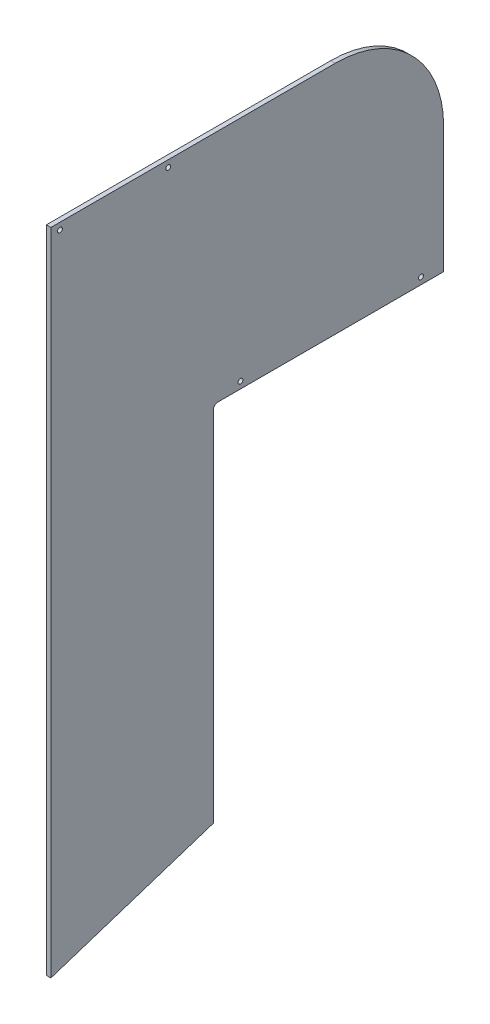
ISO-10303-21;
HEADER;
FILE_DESCRIPTION(('STEP AP214'),'2;1');
FILE_NAME('part.step','',(''),(''),'','','');
FILE_SCHEMA(('AUTOMOTIVE_DESIGN { 1 0 10303 214 1 1 1 1 }'));
ENDSEC;
DATA;
#1=APPLICATION_CONTEXT('core data for automotive mechanical design processes');
#2=APPLICATION_PROTOCOL_DEFINITION('international standard','automotive_design',2000,#1);
#3=PRODUCT_CONTEXT('',#1,'mechanical');
#4=PRODUCT('Part','Part','',(#3));
#5=PRODUCT_RELATED_PRODUCT_CATEGORY('part','',(#4));
#6=PRODUCT_DEFINITION_FORMATION('','',#4);
#7=PRODUCT_DEFINITION_CONTEXT('part definition',#1,'design');
#8=PRODUCT_DEFINITION('design','',#6,#7);
#9=PRODUCT_DEFINITION_SHAPE('','',#8);
#10=(LENGTH_UNIT() NAMED_UNIT(*) SI_UNIT(.MILLI.,.METRE.));
#11=(NAMED_UNIT(*) PLANE_ANGLE_UNIT() SI_UNIT($,.RADIAN.));
#12=(NAMED_UNIT(*) SI_UNIT($,.STERADIAN.) SOLID_ANGLE_UNIT());
#13=UNCERTAINTY_MEASURE_WITH_UNIT(LENGTH_MEASURE(1.E-05),#10,'distance_accuracy_value','');
#14=(GEOMETRIC_REPRESENTATION_CONTEXT(3) GLOBAL_UNCERTAINTY_ASSIGNED_CONTEXT((#13)) GLOBAL_UNIT_ASSIGNED_CONTEXT((#10,
#11,#12)) REPRESENTATION_CONTEXT('',''));
#15=CARTESIAN_POINT('',(0.,0.,0.));
#16=DIRECTION('',(0.,0.,1.));
#17=DIRECTION('',(1.,0.,0.));
#18=AXIS2_PLACEMENT_3D('',#15,#16,#17);
#19=CARTESIAN_POINT('',(0.,0.,0.));
#20=DIRECTION('',(1.,0.,0.));
#21=DIRECTION('',(0.,0.,-1.));
#22=AXIS2_PLACEMENT_3D('',#19,#20,#21);
#23=PLANE('',#22);
#24=CARTESIAN_POINT('',(0.,-155.575,9.525));
#25=DIRECTION('',(1.,0.,0.));
#26=DIRECTION('',(0.,0.,-1.));
#27=AXIS2_PLACEMENT_3D('',#24,#25,#26);
#28=CIRCLE('',#27,3.3655);
#29=CARTESIAN_POINT('',(0.,-155.575,6.1595));
#30=VERTEX_POINT('',#29);
#31=EDGE_CURVE('E126',#30,#30,#28,.T.);
#32=ORIENTED_EDGE('',*,*,#31,.T.);
#33=EDGE_LOOP('',(#32));
#34=FACE_BOUND('',#33,.T.);
#35=CARTESIAN_POINT('',(0.,-155.575,-244.475));
#36=DIRECTION('',(1.,0.,0.));
#37=DIRECTION('',(0.,0.,-1.));
#38=AXIS2_PLACEMENT_3D('',#35,#36,#37);
#39=CIRCLE('',#38,3.3655);
#40=CARTESIAN_POINT('',(0.,-155.575,-247.8405));
#41=VERTEX_POINT('',#40);
#42=EDGE_CURVE('E194',#41,#41,#39,.T.);
#43=ORIENTED_EDGE('',*,*,#42,.T.);
#44=EDGE_LOOP('',(#43));
#45=FACE_BOUND('',#44,.T.);
#46=CARTESIAN_POINT('',(0.,155.575,111.125));
#47=DIRECTION('',(1.,0.,0.));
#48=DIRECTION('',(0.,0.,-1.));
#49=AXIS2_PLACEMENT_3D('',#46,#47,#48);
#50=CIRCLE('',#49,3.3655);
#51=CARTESIAN_POINT('',(0.,155.575,107.7595));
#52=VERTEX_POINT('',#51);
#53=EDGE_CURVE('E197',#52,#52,#50,.T.);
#54=ORIENTED_EDGE('',*,*,#53,.T.);
#55=EDGE_LOOP('',(#54));
#56=FACE_BOUND('',#55,.T.);
#57=CARTESIAN_POINT('',(0.,155.575,263.525));
#58=DIRECTION('',(1.,0.,0.));
#59=DIRECTION('',(0.,0.,-1.));
#60=AXIS2_PLACEMENT_3D('',#57,#58,#59);
#61=CIRCLE('',#60,3.3655);
#62=CARTESIAN_POINT('',(0.,155.575,260.1595));
#63=VERTEX_POINT('',#62);
#64=EDGE_CURVE('E130',#63,#63,#61,.T.);
#65=ORIENTED_EDGE('',*,*,#64,.T.);
#66=EDGE_LOOP('',(#65));
#67=FACE_BOUND('',#66,.T.);
#68=DIRECTION('',(0.,1.,0.));
#69=VECTOR('',#68,1.);
#70=CARTESIAN_POINT('',(0.,165.1,276.225));
#71=LINE('',#70,#69);
#72=CARTESIAN_POINT('',(0.,165.1,276.225));
#73=VERTEX_POINT('',#72);
#74=CARTESIAN_POINT('',(0.,-749.3,276.225));
#75=VERTEX_POINT('',#74);
#76=EDGE_CURVE('E103',#73,#75,#71,.F.);
#77=ORIENTED_EDGE('',*,*,#76,.F.);
#78=DIRECTION('',(0.,0.,1.));
#79=VECTOR('',#78,1.);
#80=CARTESIAN_POINT('',(0.,165.1,-276.225));
#81=LINE('',#80,#79);
#82=CARTESIAN_POINT('',(0.,165.1,-123.825));
#83=VERTEX_POINT('',#82);
#84=EDGE_CURVE('E69',#83,#73,#81,.T.);
#85=ORIENTED_EDGE('',*,*,#84,.F.);
#86=CARTESIAN_POINT('',(0.,12.7,-123.825));
#87=DIRECTION('',(-1.,0.,0.));
#88=DIRECTION('',(0.,0.,1.));
#89=AXIS2_PLACEMENT_3D('',#86,#87,#88);
#90=CIRCLE('',#89,152.4);
#91=CARTESIAN_POINT('',(0.,12.7,-276.225));
#92=VERTEX_POINT('',#91);
#93=EDGE_CURVE('E20',#92,#83,#90,.F.);
#94=ORIENTED_EDGE('',*,*,#93,.F.);
#95=DIRECTION('',(0.,1.,0.));
#96=VECTOR('',#95,1.);
#97=CARTESIAN_POINT('',(0.,-165.1,-276.225));
#98=LINE('',#97,#96);
#99=CARTESIAN_POINT('',(0.,-165.1,-276.225));
#100=VERTEX_POINT('',#99);
#101=EDGE_CURVE('E62',#100,#92,#98,.T.);
#102=ORIENTED_EDGE('',*,*,#101,.F.);
#103=DIRECTION('',(0.,0.,-1.));
#104=VECTOR('',#103,1.);
#105=CARTESIAN_POINT('',(0.,-165.1,276.225));
#106=LINE('',#105,#104);
#107=CARTESIAN_POINT('',(0.,-165.1,41.275));
#108=VERTEX_POINT('',#107);
#109=EDGE_CURVE('E133',#108,#100,#106,.T.);
#110=ORIENTED_EDGE('',*,*,#109,.F.);
#111=CARTESIAN_POINT('',(0.,-171.45,41.275));
#112=DIRECTION('',(1.,0.,0.));
#113=DIRECTION('',(0.,0.,-1.));
#114=AXIS2_PLACEMENT_3D('',#111,#112,#113);
#115=CIRCLE('',#114,6.35);
#116=CARTESIAN_POINT('',(0.,-171.45,47.625));
#117=VERTEX_POINT('',#116);
#118=EDGE_CURVE('E138',#108,#117,#115,.T.);
#119=ORIENTED_EDGE('',*,*,#118,.T.);
#120=DIRECTION('',(0.,1.,0.));
#121=VECTOR('',#120,1.);
#122=CARTESIAN_POINT('',(0.,-675.02335744106,47.625));
#123=LINE('',#122,#121);
#124=CARTESIAN_POINT('',(0.,-675.023357441094,47.624999999989));
#125=VERTEX_POINT('',#124);
#126=EDGE_CURVE('E142',#125,#117,#123,.T.);
#127=ORIENTED_EDGE('',*,*,#126,.F.);
#128=DIRECTION('',(0.,0.309016994374891,-0.951056516295172));
#129=VECTOR('',#128,1.);
#130=CARTESIAN_POINT('',(0.,-749.3,276.225));
#131=LINE('',#130,#129);
#132=EDGE_CURVE('E143',#75,#125,#131,.T.);
#133=ORIENTED_EDGE('',*,*,#132,.F.);
#134=EDGE_LOOP('',(#77,#85,#94,#102,#110,#119,#127,#133));
#135=FACE_BOUND('',#134,.T.);
#136=ADVANCED_FACE('F17',(#34,#45,#56,#67,#135),#23,.F.);
#137=CARTESIAN_POINT('',(0.,-165.1,-276.225));
#138=DIRECTION('',(0.,0.,-1.));
#139=DIRECTION('',(-1.,0.,0.));
#140=AXIS2_PLACEMENT_3D('',#137,#138,#139);
#141=PLANE('',#140);
#142=ORIENTED_EDGE('',*,*,#101,.T.);
#143=DIRECTION('',(-1.,0.,0.));
#144=VECTOR('',#143,1.);
#145=CARTESIAN_POINT('',(190.23838,12.7,-276.225));
#146=LINE('',#145,#144);
#147=CARTESIAN_POINT('',(6.35,12.7,-276.225));
#148=VERTEX_POINT('',#147);
#149=EDGE_CURVE('E158',#148,#92,#146,.T.);
#150=ORIENTED_EDGE('',*,*,#149,.F.);
#151=DIRECTION('',(0.,1.,0.));
#152=VECTOR('',#151,1.);
#153=CARTESIAN_POINT('',(6.35,0.,-276.225));
#154=LINE('',#153,#152);
#155=CARTESIAN_POINT('',(6.35,-165.1,-276.225));
#156=VERTEX_POINT('',#155);
#157=EDGE_CURVE('E82',#156,#148,#154,.T.);
#158=ORIENTED_EDGE('',*,*,#157,.F.);
#159=DIRECTION('',(1.,0.,0.));
#160=VECTOR('',#159,1.);
#161=CARTESIAN_POINT('',(0.,-165.1,-276.225));
#162=LINE('',#161,#160);
#163=EDGE_CURVE('E131',#100,#156,#162,.T.);
#164=ORIENTED_EDGE('',*,*,#163,.F.);
#165=EDGE_LOOP('',(#142,#150,#158,#164));
#166=FACE_BOUND('',#165,.T.);
#167=ADVANCED_FACE('F215',(#166),#141,.T.);
#168=CARTESIAN_POINT('',(190.23838,12.7,-123.825));
#169=DIRECTION('',(-1.,0.,0.));
#170=DIRECTION('',(0.,0.,1.));
#171=AXIS2_PLACEMENT_3D('',#168,#169,#170);
#172=CYLINDRICAL_SURFACE('',#171,152.4);
#173=ORIENTED_EDGE('',*,*,#149,.T.);
#174=ORIENTED_EDGE('',*,*,#93,.T.);
#175=DIRECTION('',(1.,0.,0.));
#176=VECTOR('',#175,1.);
#177=CARTESIAN_POINT('',(0.,165.1,-123.825));
#178=LINE('',#177,#176);
#179=CARTESIAN_POINT('',(6.35,165.1,-123.825));
#180=VERTEX_POINT('',#179);
#181=EDGE_CURVE('E104',#180,#83,#178,.F.);
#182=ORIENTED_EDGE('',*,*,#181,.F.);
#183=CARTESIAN_POINT('',(6.34999999999999,12.7,-123.825));
#184=DIRECTION('',(-1.,0.,0.));
#185=DIRECTION('',(0.,0.,1.));
#186=AXIS2_PLACEMENT_3D('',#183,#184,#185);
#187=CIRCLE('',#186,152.4);
#188=EDGE_CURVE('E116',#148,#180,#187,.F.);
#189=ORIENTED_EDGE('',*,*,#188,.F.);
#190=EDGE_LOOP('',(#173,#174,#182,#189));
#191=FACE_BOUND('',#190,.T.);
#192=ADVANCED_FACE('F217',(#191),#172,.T.);
#193=CARTESIAN_POINT('',(0.,165.1,-276.225));
#194=DIRECTION('',(0.,1.,0.));
#195=DIRECTION('',(0.,0.,1.));
#196=AXIS2_PLACEMENT_3D('',#193,#194,#195);
#197=PLANE('',#196);
#198=DIRECTION('',(0.,0.,-1.));
#199=VECTOR('',#198,1.);
#200=CARTESIAN_POINT('',(6.35,165.1,0.));
#201=LINE('',#200,#199);
#202=CARTESIAN_POINT('',(6.35,165.1,276.225));
#203=VERTEX_POINT('',#202);
#204=EDGE_CURVE('E101',#180,#203,#201,.F.);
#205=ORIENTED_EDGE('',*,*,#204,.F.);
#206=ORIENTED_EDGE('',*,*,#181,.T.);
#207=ORIENTED_EDGE('',*,*,#84,.T.);
#208=DIRECTION('',(1.,0.,0.));
#209=VECTOR('',#208,1.);
#210=CARTESIAN_POINT('',(0.,165.1,276.225));
#211=LINE('',#210,#209);
#212=EDGE_CURVE('E98',#203,#73,#211,.F.);
#213=ORIENTED_EDGE('',*,*,#212,.F.);
#214=EDGE_LOOP('',(#205,#206,#207,#213));
#215=FACE_BOUND('',#214,.T.);
#216=ADVANCED_FACE('F99',(#215),#197,.T.);
#217=CARTESIAN_POINT('',(0.,165.1,276.225));
#218=DIRECTION('',(0.,0.,1.));
#219=DIRECTION('',(1.,0.,0.));
#220=AXIS2_PLACEMENT_3D('',#217,#218,#219);
#221=PLANE('',#220);
#222=DIRECTION('',(1.,0.,0.));
#223=VECTOR('',#222,1.);
#224=CARTESIAN_POINT('',(6.35,-749.3,276.225));
#225=LINE('',#224,#223);
#226=CARTESIAN_POINT('',(6.35,-749.3,276.225));
#227=VERTEX_POINT('',#226);
#228=EDGE_CURVE('E94',#227,#75,#225,.F.);
#229=ORIENTED_EDGE('',*,*,#228,.F.);
#230=DIRECTION('',(0.,1.,0.));
#231=VECTOR('',#230,1.);
#232=CARTESIAN_POINT('',(6.35,0.,276.225));
#233=LINE('',#232,#231);
#234=EDGE_CURVE('E107',#203,#227,#233,.F.);
#235=ORIENTED_EDGE('',*,*,#234,.F.);
#236=ORIENTED_EDGE('',*,*,#212,.T.);
#237=ORIENTED_EDGE('',*,*,#76,.T.);
#238=EDGE_LOOP('',(#229,#235,#236,#237));
#239=FACE_BOUND('',#238,.T.);
#240=ADVANCED_FACE('F108',(#239),#221,.T.);
#241=CARTESIAN_POINT('',(6.35,-749.3,276.225));
#242=DIRECTION('',(0.,-0.951056516295172,-0.309016994374891));
#243=DIRECTION('',(0.,0.309016994374891,-0.951056516295172));
#244=AXIS2_PLACEMENT_3D('',#241,#242,#243);
#245=PLANE('',#244);
#246=DIRECTION('',(-1.,0.,0.));
#247=VECTOR('',#246,1.);
#248=CARTESIAN_POINT('',(6.35,-675.02335744106,47.625));
#249=LINE('',#248,#247);
#250=CARTESIAN_POINT('',(6.35,-675.02335744106,47.625));
#251=VERTEX_POINT('',#250);
#252=EDGE_CURVE('E139',#251,#125,#249,.T.);
#253=ORIENTED_EDGE('',*,*,#252,.F.);
#254=DIRECTION('',(0.,0.309016994375315,-0.951056516295034));
#255=VECTOR('',#254,1.);
#256=CARTESIAN_POINT('',(6.35,-749.3,276.225));
#257=LINE('',#256,#255);
#258=EDGE_CURVE('E111',#227,#251,#257,.T.);
#259=ORIENTED_EDGE('',*,*,#258,.F.);
#260=ORIENTED_EDGE('',*,*,#228,.T.);
#261=ORIENTED_EDGE('',*,*,#132,.T.);
#262=EDGE_LOOP('',(#253,#259,#260,#261));
#263=FACE_BOUND('',#262,.T.);
#264=ADVANCED_FACE('F255',(#263),#245,.T.);
#265=CARTESIAN_POINT('',(6.35,-675.02335744106,47.625));
#266=DIRECTION('',(0.,0.,-1.));
#267=DIRECTION('',(-1.,0.,0.));
#268=AXIS2_PLACEMENT_3D('',#265,#266,#267);
#269=PLANE('',#268);
#270=ORIENTED_EDGE('',*,*,#126,.T.);
#271=DIRECTION('',(1.,0.,0.));
#272=VECTOR('',#271,1.);
#273=CARTESIAN_POINT('',(-8.27786,-171.45,47.625));
#274=LINE('',#273,#272);
#275=CARTESIAN_POINT('',(6.35,-171.45,47.625));
#276=VERTEX_POINT('',#275);
#277=EDGE_CURVE('E136',#117,#276,#274,.T.);
#278=ORIENTED_EDGE('',*,*,#277,.T.);
#279=DIRECTION('',(0.,1.,0.));
#280=VECTOR('',#279,1.);
#281=CARTESIAN_POINT('',(6.35,0.,47.625));
#282=LINE('',#281,#280);
#283=EDGE_CURVE('E147',#251,#276,#282,.T.);
#284=ORIENTED_EDGE('',*,*,#283,.F.);
#285=ORIENTED_EDGE('',*,*,#252,.T.);
#286=EDGE_LOOP('',(#270,#278,#284,#285));
#287=FACE_BOUND('',#286,.T.);
#288=ADVANCED_FACE('F205',(#287),#269,.T.);
#289=CARTESIAN_POINT('',(-8.27786,-171.45,41.275));
#290=DIRECTION('',(1.,0.,0.));
#291=DIRECTION('',(0.,0.,-1.));
#292=AXIS2_PLACEMENT_3D('',#289,#290,#291);
#293=CYLINDRICAL_SURFACE('',#292,6.35);
#294=ORIENTED_EDGE('',*,*,#277,.F.);
#295=ORIENTED_EDGE('',*,*,#118,.F.);
#296=DIRECTION('',(1.,0.,0.));
#297=VECTOR('',#296,1.);
#298=CARTESIAN_POINT('',(0.,-165.1,41.275));
#299=LINE('',#298,#297);
#300=CARTESIAN_POINT('',(6.35,-165.1,41.275));
#301=VERTEX_POINT('',#300);
#302=EDGE_CURVE('E35',#301,#108,#299,.F.);
#303=ORIENTED_EDGE('',*,*,#302,.F.);
#304=CARTESIAN_POINT('',(6.35,-171.45,41.275));
#305=DIRECTION('',(1.,0.,0.));
#306=DIRECTION('',(0.,0.,-1.));
#307=AXIS2_PLACEMENT_3D('',#304,#305,#306);
#308=CIRCLE('',#307,6.35);
#309=EDGE_CURVE('E190',#276,#301,#308,.F.);
#310=ORIENTED_EDGE('',*,*,#309,.F.);
#311=EDGE_LOOP('',(#294,#295,#303,#310));
#312=FACE_BOUND('',#311,.T.);
#313=ADVANCED_FACE('F207',(#312),#293,.F.);
#314=CARTESIAN_POINT('',(0.,-165.1,276.225));
#315=DIRECTION('',(0.,-1.,0.));
#316=DIRECTION('',(0.,0.,-1.));
#317=AXIS2_PLACEMENT_3D('',#314,#315,#316);
#318=PLANE('',#317);
#319=DIRECTION('',(0.,0.,-1.));
#320=VECTOR('',#319,1.);
#321=CARTESIAN_POINT('',(6.35,-165.1,0.));
#322=LINE('',#321,#320);
#323=EDGE_CURVE('E189',#301,#156,#322,.T.);
#324=ORIENTED_EDGE('',*,*,#323,.F.);
#325=ORIENTED_EDGE('',*,*,#302,.T.);
#326=ORIENTED_EDGE('',*,*,#109,.T.);
#327=ORIENTED_EDGE('',*,*,#163,.T.);
#328=EDGE_LOOP('',(#324,#325,#326,#327));
#329=FACE_BOUND('',#328,.T.);
#330=ADVANCED_FACE('F214',(#329),#318,.T.);
#331=CARTESIAN_POINT('',(6.35,155.575,263.525));
#332=DIRECTION('',(1.,0.,0.));
#333=DIRECTION('',(0.,0.,-1.));
#334=AXIS2_PLACEMENT_3D('',#331,#332,#333);
#335=CYLINDRICAL_SURFACE('',#334,3.3655);
#336=ORIENTED_EDGE('',*,*,#64,.F.);
#337=EDGE_LOOP('',(#336));
#338=FACE_BOUND('',#337,.T.);
#339=CARTESIAN_POINT('',(6.35,155.575,263.525));
#340=DIRECTION('',(1.,0.,0.));
#341=DIRECTION('',(0.,0.,-1.));
#342=AXIS2_PLACEMENT_3D('',#339,#340,#341);
#343=CIRCLE('',#342,3.3655);
#344=CARTESIAN_POINT('',(6.35,155.575,260.1595));
#345=VERTEX_POINT('',#344);
#346=EDGE_CURVE('E186',#345,#345,#343,.F.);
#347=ORIENTED_EDGE('',*,*,#346,.F.);
#348=EDGE_LOOP('',(#347));
#349=FACE_BOUND('',#348,.T.);
#350=ADVANCED_FACE('F244',(#338,#349),#335,.F.);
#351=CARTESIAN_POINT('',(6.35,155.575,111.125));
#352=DIRECTION('',(1.,0.,0.));
#353=DIRECTION('',(0.,0.,-1.));
#354=AXIS2_PLACEMENT_3D('',#351,#352,#353);
#355=CYLINDRICAL_SURFACE('',#354,3.3655);
#356=ORIENTED_EDGE('',*,*,#53,.F.);
#357=EDGE_LOOP('',(#356));
#358=FACE_BOUND('',#357,.T.);
#359=CARTESIAN_POINT('',(6.35,155.575,111.125));
#360=DIRECTION('',(1.,0.,0.));
#361=DIRECTION('',(0.,0.,-1.));
#362=AXIS2_PLACEMENT_3D('',#359,#360,#361);
#363=CIRCLE('',#362,3.3655);
#364=CARTESIAN_POINT('',(6.35,155.575,107.7595));
#365=VERTEX_POINT('',#364);
#366=EDGE_CURVE('E183',#365,#365,#363,.F.);
#367=ORIENTED_EDGE('',*,*,#366,.F.);
#368=EDGE_LOOP('',(#367));
#369=FACE_BOUND('',#368,.T.);
#370=ADVANCED_FACE('F240',(#358,#369),#355,.F.);
#371=CARTESIAN_POINT('',(6.35,-155.575,-244.475));
#372=DIRECTION('',(1.,0.,0.));
#373=DIRECTION('',(0.,0.,-1.));
#374=AXIS2_PLACEMENT_3D('',#371,#372,#373);
#375=CYLINDRICAL_SURFACE('',#374,3.3655);
#376=ORIENTED_EDGE('',*,*,#42,.F.);
#377=EDGE_LOOP('',(#376));
#378=FACE_BOUND('',#377,.T.);
#379=CARTESIAN_POINT('',(6.35,-155.575,-244.475));
#380=DIRECTION('',(1.,0.,0.));
#381=DIRECTION('',(0.,0.,-1.));
#382=AXIS2_PLACEMENT_3D('',#379,#380,#381);
#383=CIRCLE('',#382,3.3655);
#384=CARTESIAN_POINT('',(6.35,-155.575,-247.8405));
#385=VERTEX_POINT('',#384);
#386=EDGE_CURVE('E26',#385,#385,#383,.F.);
#387=ORIENTED_EDGE('',*,*,#386,.F.);
#388=EDGE_LOOP('',(#387));
#389=FACE_BOUND('',#388,.T.);
#390=ADVANCED_FACE('F233',(#378,#389),#375,.F.);
#391=CARTESIAN_POINT('',(6.35,-155.575,9.525));
#392=DIRECTION('',(1.,0.,0.));
#393=DIRECTION('',(0.,0.,-1.));
#394=AXIS2_PLACEMENT_3D('',#391,#392,#393);
#395=CYLINDRICAL_SURFACE('',#394,3.3655);
#396=ORIENTED_EDGE('',*,*,#31,.F.);
#397=EDGE_LOOP('',(#396));
#398=FACE_BOUND('',#397,.T.);
#399=CARTESIAN_POINT('',(6.35,-155.575,9.525));
#400=DIRECTION('',(1.,0.,0.));
#401=DIRECTION('',(0.,0.,-1.));
#402=AXIS2_PLACEMENT_3D('',#399,#400,#401);
#403=CIRCLE('',#402,3.3655);
#404=CARTESIAN_POINT('',(6.35,-155.575,6.1595));
#405=VERTEX_POINT('',#404);
#406=EDGE_CURVE('E11',#405,#405,#403,.F.);
#407=ORIENTED_EDGE('',*,*,#406,.F.);
#408=EDGE_LOOP('',(#407));
#409=FACE_BOUND('',#408,.T.);
#410=ADVANCED_FACE('F227',(#398,#409),#395,.F.);
#411=CARTESIAN_POINT('',(6.35,0.,0.));
#412=DIRECTION('',(1.,0.,0.));
#413=DIRECTION('',(0.,0.,-1.));
#414=AXIS2_PLACEMENT_3D('',#411,#412,#413);
#415=PLANE('',#414);
#416=ORIENTED_EDGE('',*,*,#406,.T.);
#417=EDGE_LOOP('',(#416));
#418=FACE_BOUND('',#417,.T.);
#419=ORIENTED_EDGE('',*,*,#386,.T.);
#420=EDGE_LOOP('',(#419));
#421=FACE_BOUND('',#420,.T.);
#422=ORIENTED_EDGE('',*,*,#366,.T.);
#423=EDGE_LOOP('',(#422));
#424=FACE_BOUND('',#423,.T.);
#425=ORIENTED_EDGE('',*,*,#346,.T.);
#426=EDGE_LOOP('',(#425));
#427=FACE_BOUND('',#426,.T.);
#428=ORIENTED_EDGE('',*,*,#309,.T.);
#429=ORIENTED_EDGE('',*,*,#323,.T.);
#430=ORIENTED_EDGE('',*,*,#157,.T.);
#431=ORIENTED_EDGE('',*,*,#188,.T.);
#432=ORIENTED_EDGE('',*,*,#204,.T.);
#433=ORIENTED_EDGE('',*,*,#234,.T.);
#434=ORIENTED_EDGE('',*,*,#258,.T.);
#435=ORIENTED_EDGE('',*,*,#283,.T.);
#436=EDGE_LOOP('',(#428,#429,#430,#431,#432,#433,#434,#435));
#437=FACE_BOUND('',#436,.T.);
#438=ADVANCED_FACE('F114',(#418,#421,#424,#427,#437),#415,.T.);
#439=CLOSED_SHELL('',(#136,#167,#192,#216,#240,#264,#288,#313,#330,#350,#370,#390,#410,#438));
#440=MANIFOLD_SOLID_BREP('B1',#439);
#441=ADVANCED_BREP_SHAPE_REPRESENTATION('',(#18,#440),#14);
#442=SHAPE_DEFINITION_REPRESENTATION(#9,#441);
ENDSEC;
END-ISO-10303-21;
